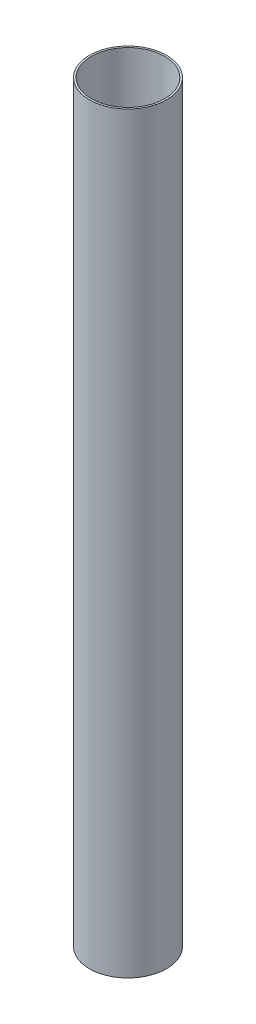
ISO-10303-21;
HEADER;
FILE_DESCRIPTION(('STEP AP214'),'2;1');
FILE_NAME('part.step','',(''),(''),'','','');
FILE_SCHEMA(('AUTOMOTIVE_DESIGN { 1 0 10303 214 1 1 1 1 }'));
ENDSEC;
DATA;
#1=APPLICATION_CONTEXT('core data for automotive mechanical design processes');
#2=APPLICATION_PROTOCOL_DEFINITION('international standard','automotive_design',2000,#1);
#3=PRODUCT_CONTEXT('',#1,'mechanical');
#4=PRODUCT('Part','Part','',(#3));
#5=PRODUCT_RELATED_PRODUCT_CATEGORY('part','',(#4));
#6=PRODUCT_DEFINITION_FORMATION('','',#4);
#7=PRODUCT_DEFINITION_CONTEXT('part definition',#1,'design');
#8=PRODUCT_DEFINITION('design','',#6,#7);
#9=PRODUCT_DEFINITION_SHAPE('','',#8);
#10=(LENGTH_UNIT() NAMED_UNIT(*) SI_UNIT(.MILLI.,.METRE.));
#11=(NAMED_UNIT(*) PLANE_ANGLE_UNIT() SI_UNIT($,.RADIAN.));
#12=(NAMED_UNIT(*) SI_UNIT($,.STERADIAN.) SOLID_ANGLE_UNIT());
#13=UNCERTAINTY_MEASURE_WITH_UNIT(LENGTH_MEASURE(1.E-05),#10,'distance_accuracy_value','');
#14=(GEOMETRIC_REPRESENTATION_CONTEXT(3) GLOBAL_UNCERTAINTY_ASSIGNED_CONTEXT((#13)) GLOBAL_UNIT_ASSIGNED_CONTEXT((#10,
#11,#12)) REPRESENTATION_CONTEXT('',''));
#15=CARTESIAN_POINT('',(0.,0.,0.));
#16=DIRECTION('',(0.,0.,1.));
#17=DIRECTION('',(1.,0.,0.));
#18=AXIS2_PLACEMENT_3D('',#15,#16,#17);
#19=CARTESIAN_POINT('',(0.,495.3,0.));
#20=DIRECTION('',(0.,1.,0.));
#21=DIRECTION('',(0.,0.,1.));
#22=AXIS2_PLACEMENT_3D('',#19,#20,#21);
#23=PLANE('',#22);
#24=CARTESIAN_POINT('',(0.,495.3,0.));
#25=DIRECTION('',(0.,1.,0.));
#26=DIRECTION('',(0.,0.,1.));
#27=AXIS2_PLACEMENT_3D('',#24,#25,#26);
#28=CIRCLE('',#27,25.4);
#29=CARTESIAN_POINT('',(0.,495.3,25.4));
#30=VERTEX_POINT('',#29);
#31=EDGE_CURVE('E10',#30,#30,#28,.T.);
#32=ORIENTED_EDGE('',*,*,#31,.T.);
#33=EDGE_LOOP('',(#32));
#34=FACE_BOUND('',#33,.T.);
#35=CARTESIAN_POINT('',(0.,495.3,0.));
#36=DIRECTION('',(0.,1.,0.));
#37=DIRECTION('',(0.,0.,1.));
#38=AXIS2_PLACEMENT_3D('',#35,#36,#37);
#39=CIRCLE('',#38,24.1554);
#40=CARTESIAN_POINT('',(0.,495.3,24.1554));
#41=VERTEX_POINT('',#40);
#42=EDGE_CURVE('E50',#41,#41,#39,.T.);
#43=ORIENTED_EDGE('',*,*,#42,.F.);
#44=EDGE_LOOP('',(#43));
#45=FACE_BOUND('',#44,.T.);
#46=ADVANCED_FACE('F37',(#34,#45),#23,.T.);
#47=CARTESIAN_POINT('',(0.,0.,0.));
#48=DIRECTION('',(0.,1.,0.));
#49=DIRECTION('',(0.,0.,1.));
#50=AXIS2_PLACEMENT_3D('',#47,#48,#49);
#51=PLANE('',#50);
#52=CARTESIAN_POINT('',(0.,0.,0.));
#53=DIRECTION('',(0.,1.,0.));
#54=DIRECTION('',(0.,0.,1.));
#55=AXIS2_PLACEMENT_3D('',#52,#53,#54);
#56=CIRCLE('',#55,25.4);
#57=CARTESIAN_POINT('',(0.,0.,25.4));
#58=VERTEX_POINT('',#57);
#59=EDGE_CURVE('E41',#58,#58,#56,.T.);
#60=ORIENTED_EDGE('',*,*,#59,.F.);
#61=EDGE_LOOP('',(#60));
#62=FACE_BOUND('',#61,.T.);
#63=CARTESIAN_POINT('',(0.,0.,0.));
#64=DIRECTION('',(0.,1.,0.));
#65=DIRECTION('',(0.,0.,1.));
#66=AXIS2_PLACEMENT_3D('',#63,#64,#65);
#67=CIRCLE('',#66,24.1554);
#68=CARTESIAN_POINT('',(0.,0.,24.1554));
#69=VERTEX_POINT('',#68);
#70=EDGE_CURVE('E52',#69,#69,#67,.T.);
#71=ORIENTED_EDGE('',*,*,#70,.T.);
#72=EDGE_LOOP('',(#71));
#73=FACE_BOUND('',#72,.T.);
#74=ADVANCED_FACE('F64',(#62,#73),#51,.F.);
#75=CARTESIAN_POINT('',(0.,495.3,0.));
#76=DIRECTION('',(0.,-1.,0.));
#77=DIRECTION('',(0.,0.,-1.));
#78=AXIS2_PLACEMENT_3D('',#75,#76,#77);
#79=CYLINDRICAL_SURFACE('',#78,25.4);
#80=ORIENTED_EDGE('',*,*,#31,.F.);
#81=EDGE_LOOP('',(#80));
#82=FACE_BOUND('',#81,.T.);
#83=ORIENTED_EDGE('',*,*,#59,.T.);
#84=EDGE_LOOP('',(#83));
#85=FACE_BOUND('',#84,.T.);
#86=ADVANCED_FACE('F39',(#82,#85),#79,.T.);
#87=CARTESIAN_POINT('',(0.,495.3,0.));
#88=DIRECTION('',(0.,-1.,0.));
#89=DIRECTION('',(0.,0.,-1.));
#90=AXIS2_PLACEMENT_3D('',#87,#88,#89);
#91=CYLINDRICAL_SURFACE('',#90,24.1554);
#92=ORIENTED_EDGE('',*,*,#42,.T.);
#93=EDGE_LOOP('',(#92));
#94=FACE_BOUND('',#93,.T.);
#95=ORIENTED_EDGE('',*,*,#70,.F.);
#96=EDGE_LOOP('',(#95));
#97=FACE_BOUND('',#96,.T.);
#98=ADVANCED_FACE('F60',(#94,#97),#91,.F.);
#99=CLOSED_SHELL('',(#46,#74,#86,#98));
#100=MANIFOLD_SOLID_BREP('B2',#99);
#101=ADVANCED_BREP_SHAPE_REPRESENTATION('',(#18,#100),#14);
#102=SHAPE_DEFINITION_REPRESENTATION(#9,#101);
ENDSEC;
END-ISO-10303-21;
